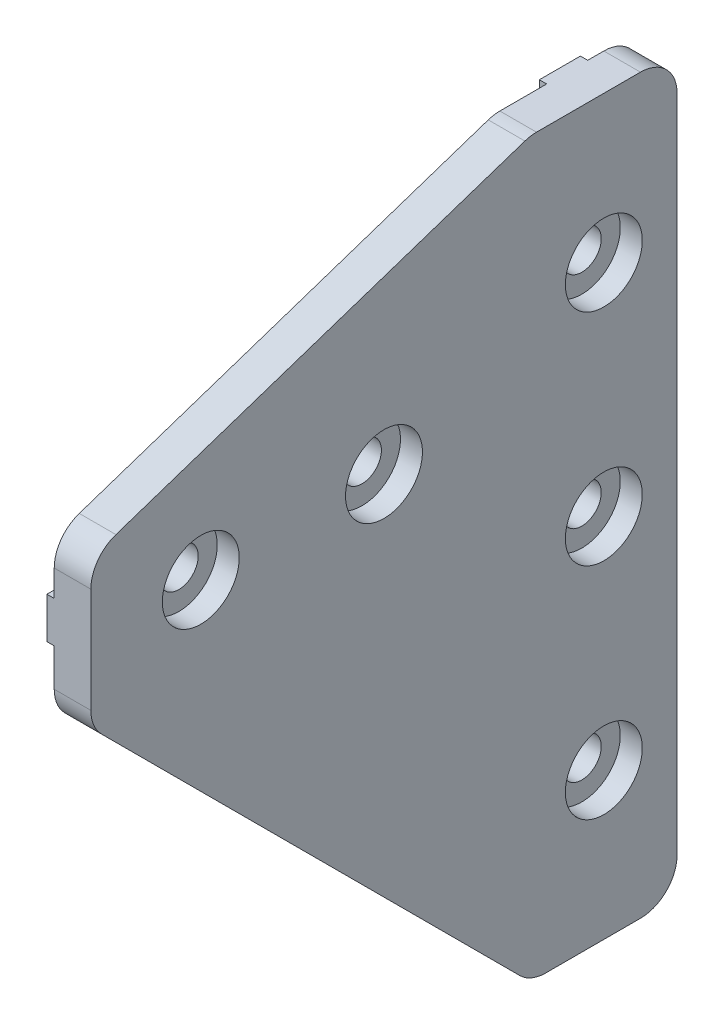
ISO-10303-21;
HEADER;
FILE_DESCRIPTION(('STEP AP214'),'2;1');
FILE_NAME('part.step','',(''),(''),'','','');
FILE_SCHEMA(('AUTOMOTIVE_DESIGN { 1 0 10303 214 1 1 1 1 }'));
ENDSEC;
DATA;
#1=APPLICATION_CONTEXT('core data for automotive mechanical design processes');
#2=APPLICATION_PROTOCOL_DEFINITION('international standard','automotive_design',2000,#1);
#3=PRODUCT_CONTEXT('',#1,'mechanical');
#4=PRODUCT('Part','Part','',(#3));
#5=PRODUCT_RELATED_PRODUCT_CATEGORY('part','',(#4));
#6=PRODUCT_DEFINITION_FORMATION('','',#4);
#7=PRODUCT_DEFINITION_CONTEXT('part definition',#1,'design');
#8=PRODUCT_DEFINITION('design','',#6,#7);
#9=PRODUCT_DEFINITION_SHAPE('','',#8);
#10=(LENGTH_UNIT() NAMED_UNIT(*) SI_UNIT(.MILLI.,.METRE.));
#11=(NAMED_UNIT(*) PLANE_ANGLE_UNIT() SI_UNIT($,.RADIAN.));
#12=(NAMED_UNIT(*) SI_UNIT($,.STERADIAN.) SOLID_ANGLE_UNIT());
#13=UNCERTAINTY_MEASURE_WITH_UNIT(LENGTH_MEASURE(1.E-05),#10,'distance_accuracy_value','');
#14=(GEOMETRIC_REPRESENTATION_CONTEXT(3) GLOBAL_UNCERTAINTY_ASSIGNED_CONTEXT((#13)) GLOBAL_UNIT_ASSIGNED_CONTEXT((#10,
#11,#12)) REPRESENTATION_CONTEXT('',''));
#15=CARTESIAN_POINT('',(0.,0.,0.));
#16=DIRECTION('',(0.,0.,1.));
#17=DIRECTION('',(1.,0.,0.));
#18=AXIS2_PLACEMENT_3D('',#15,#16,#17);
#19=CARTESIAN_POINT('',(67.5,0.,40.));
#20=DIRECTION('',(1.,0.,0.));
#21=DIRECTION('',(0.,-1.,0.));
#22=AXIS2_PLACEMENT_3D('',#19,#20,#21);
#23=PLANE('',#22);
#24=DIRECTION('',(0.,-1.,0.));
#25=VECTOR('',#24,1.);
#26=CARTESIAN_POINT('',(67.5,120.,80.));
#27=LINE('',#26,#25);
#28=CARTESIAN_POINT('',(67.5,117.2,80.));
#29=VERTEX_POINT('',#28);
#30=CARTESIAN_POINT('',(67.5,112.071067811865,80.));
#31=VERTEX_POINT('',#30);
#32=EDGE_CURVE('E401',#29,#31,#27,.T.);
#33=ORIENTED_EDGE('',*,*,#32,.F.);
#34=DIRECTION('',(0.,0.,-1.));
#35=VECTOR('',#34,1.);
#36=CARTESIAN_POINT('',(67.5,117.2,52.5));
#37=LINE('',#36,#35);
#38=CARTESIAN_POINT('',(67.5,117.2,25.));
#39=VERTEX_POINT('',#38);
#40=EDGE_CURVE('E208',#29,#39,#37,.T.);
#41=ORIENTED_EDGE('',*,*,#40,.T.);
#42=DIRECTION('',(0.,1.,0.));
#43=VECTOR('',#42,1.);
#44=CARTESIAN_POINT('',(67.5,120.,25.));
#45=LINE('',#44,#43);
#46=CARTESIAN_POINT('',(67.5,122.8,25.));
#47=VERTEX_POINT('',#46);
#48=EDGE_CURVE('E223',#39,#47,#45,.T.);
#49=ORIENTED_EDGE('',*,*,#48,.T.);
#50=DIRECTION('',(0.,0.,-1.));
#51=VECTOR('',#50,1.);
#52=CARTESIAN_POINT('',(67.5,122.8,52.5));
#53=LINE('',#52,#51);
#54=CARTESIAN_POINT('',(67.5,122.8,80.));
#55=VERTEX_POINT('',#54);
#56=EDGE_CURVE('E37',#55,#47,#53,.T.);
#57=ORIENTED_EDGE('',*,*,#56,.F.);
#58=CARTESIAN_POINT('',(67.5,126.396203899719,80.));
#59=VERTEX_POINT('',#58);
#60=EDGE_CURVE('E402',#59,#55,#27,.T.);
#61=ORIENTED_EDGE('',*,*,#60,.F.);
#62=CARTESIAN_POINT('',(67.5,126.396203899719,75.));
#63=DIRECTION('',(-1.,0.,0.));
#64=DIRECTION('',(0.,0.,1.));
#65=AXIS2_PLACEMENT_3D('',#62,#63,#64);
#66=CIRCLE('',#65,5.);
#67=CARTESIAN_POINT('',(67.5,131.139620389972,76.5811388300842));
#68=VERTEX_POINT('',#67);
#69=EDGE_CURVE('E430',#68,#59,#66,.F.);
#70=ORIENTED_EDGE('',*,*,#69,.F.);
#71=DIRECTION('',(0.,-0.316227766016837,0.948683298050514));
#72=VECTOR('',#71,1.);
#73=CARTESIAN_POINT('',(67.5,140.,50.));
#74=LINE('',#73,#72);
#75=CARTESIAN_POINT('',(67.5,149.743416490253,20.7697505292423));
#76=VERTEX_POINT('',#75);
#77=EDGE_CURVE('E317',#76,#68,#74,.T.);
#78=ORIENTED_EDGE('',*,*,#77,.F.);
#79=CARTESIAN_POINT('',(67.5,145.,19.1886116991581));
#80=DIRECTION('',(-1.,0.,0.));
#81=DIRECTION('',(0.,0.,1.));
#82=AXIS2_PLACEMENT_3D('',#79,#80,#81);
#83=CIRCLE('',#82,5.);
#84=CARTESIAN_POINT('',(67.5,150.,19.1886116991581));
#85=VERTEX_POINT('',#84);
#86=EDGE_CURVE('E440',#85,#76,#83,.F.);
#87=ORIENTED_EDGE('',*,*,#86,.F.);
#88=DIRECTION('',(0.,0.,1.));
#89=VECTOR('',#88,1.);
#90=CARTESIAN_POINT('',(67.5,150.,10.));
#91=LINE('',#90,#89);
#92=CARTESIAN_POINT('',(67.5,150.,12.8));
#93=VERTEX_POINT('',#92);
#94=EDGE_CURVE('E413',#93,#85,#91,.T.);
#95=ORIENTED_EDGE('',*,*,#94,.F.);
#96=DIRECTION('',(0.,1.,0.));
#97=VECTOR('',#96,1.);
#98=CARTESIAN_POINT('',(67.5,100.,12.8));
#99=LINE('',#98,#97);
#100=CARTESIAN_POINT('',(67.5,50.,12.8));
#101=VERTEX_POINT('',#100);
#102=EDGE_CURVE('E49',#101,#93,#99,.T.);
#103=ORIENTED_EDGE('',*,*,#102,.F.);
#104=DIRECTION('',(0.,0.,1.));
#105=VECTOR('',#104,1.);
#106=CARTESIAN_POINT('',(67.5,50.,10.));
#107=LINE('',#106,#105);
#108=CARTESIAN_POINT('',(67.5,50.,17.9289321881345));
#109=VERTEX_POINT('',#108);
#110=EDGE_CURVE('E409',#101,#109,#107,.T.);
#111=ORIENTED_EDGE('',*,*,#110,.T.);
#112=CARTESIAN_POINT('',(67.5,55.,17.9289321881345));
#113=DIRECTION('',(-1.,0.,0.));
#114=DIRECTION('',(0.,0.,1.));
#115=AXIS2_PLACEMENT_3D('',#112,#113,#114);
#116=CIRCLE('',#115,5.);
#117=CARTESIAN_POINT('',(67.5,51.4644660940672,21.4644660940672));
#118=VERTEX_POINT('',#117);
#119=EDGE_CURVE('E436',#118,#109,#116,.F.);
#120=ORIENTED_EDGE('',*,*,#119,.F.);
#121=DIRECTION('',(0.,-0.707106781186548,-0.707106781186548));
#122=VECTOR('',#121,1.);
#123=CARTESIAN_POINT('',(67.5,80.,50.));
#124=LINE('',#123,#122);
#125=CARTESIAN_POINT('',(67.5,108.535533905933,78.5355339059327));
#126=VERTEX_POINT('',#125);
#127=EDGE_CURVE('E397',#126,#118,#124,.T.);
#128=ORIENTED_EDGE('',*,*,#127,.F.);
#129=CARTESIAN_POINT('',(67.5,112.071067811865,75.));
#130=DIRECTION('',(-1.,0.,0.));
#131=DIRECTION('',(0.,0.,1.));
#132=AXIS2_PLACEMENT_3D('',#129,#130,#131);
#133=CIRCLE('',#132,5.);
#134=EDGE_CURVE('E433',#31,#126,#133,.F.);
#135=ORIENTED_EDGE('',*,*,#134,.F.);
#136=EDGE_LOOP('',(#33,#41,#49,#57,#61,#70,#78,#87,#95,#103,#111,#120,#128,#135));
#137=FACE_BOUND('',#136,.T.);
#138=ADVANCED_FACE('F16',(#137),#23,.F.);
#139=CARTESIAN_POINT('',(72.5,100.,10.));
#140=DIRECTION('',(-1.,0.,0.));
#141=DIRECTION('',(0.,0.,-1.));
#142=AXIS2_PLACEMENT_3D('',#139,#140,#141);
#143=CYLINDRICAL_SURFACE('',#142,2.65);
#144=CARTESIAN_POINT('',(69.5,100.,10.));
#145=DIRECTION('',(-1.,0.,0.));
#146=DIRECTION('',(0.,0.,1.));
#147=AXIS2_PLACEMENT_3D('',#144,#145,#146);
#148=CIRCLE('',#147,2.65);
#149=CARTESIAN_POINT('',(69.5,100.,12.65));
#150=VERTEX_POINT('',#149);
#151=EDGE_CURVE('E345',#150,#150,#148,.T.);
#152=ORIENTED_EDGE('',*,*,#151,.F.);
#153=EDGE_LOOP('',(#152));
#154=FACE_BOUND('',#153,.T.);
#155=CARTESIAN_POINT('',(66.5,100.,10.));
#156=DIRECTION('',(-1.,0.,0.));
#157=DIRECTION('',(0.,0.,1.));
#158=AXIS2_PLACEMENT_3D('',#155,#156,#157);
#159=CIRCLE('',#158,2.65);
#160=CARTESIAN_POINT('',(66.5,100.,12.65));
#161=VERTEX_POINT('',#160);
#162=EDGE_CURVE('E264',#161,#161,#159,.T.);
#163=ORIENTED_EDGE('',*,*,#162,.T.);
#164=EDGE_LOOP('',(#163));
#165=FACE_BOUND('',#164,.T.);
#166=ADVANCED_FACE('F578',(#154,#165),#143,.F.);
#167=CARTESIAN_POINT('',(72.5,130.,10.));
#168=DIRECTION('',(-1.,0.,0.));
#169=DIRECTION('',(0.,0.,-1.));
#170=AXIS2_PLACEMENT_3D('',#167,#168,#169);
#171=CYLINDRICAL_SURFACE('',#170,2.65);
#172=CARTESIAN_POINT('',(69.5,130.,10.));
#173=DIRECTION('',(-1.,0.,0.));
#174=DIRECTION('',(0.,0.,1.));
#175=AXIS2_PLACEMENT_3D('',#172,#173,#174);
#176=CIRCLE('',#175,2.65);
#177=CARTESIAN_POINT('',(69.5,130.,12.65));
#178=VERTEX_POINT('',#177);
#179=EDGE_CURVE('E333',#178,#178,#176,.T.);
#180=ORIENTED_EDGE('',*,*,#179,.F.);
#181=EDGE_LOOP('',(#180));
#182=FACE_BOUND('',#181,.T.);
#183=CARTESIAN_POINT('',(66.5,130.,10.));
#184=DIRECTION('',(-1.,0.,0.));
#185=DIRECTION('',(0.,0.,1.));
#186=AXIS2_PLACEMENT_3D('',#183,#184,#185);
#187=CIRCLE('',#186,2.65);
#188=CARTESIAN_POINT('',(66.5,130.,12.65));
#189=VERTEX_POINT('',#188);
#190=EDGE_CURVE('E269',#189,#189,#187,.T.);
#191=ORIENTED_EDGE('',*,*,#190,.T.);
#192=EDGE_LOOP('',(#191));
#193=FACE_BOUND('',#192,.T.);
#194=ADVANCED_FACE('F585',(#182,#193),#171,.F.);
#195=CARTESIAN_POINT('',(72.5,120.,40.));
#196=DIRECTION('',(-1.,0.,0.));
#197=DIRECTION('',(0.,0.,-1.));
#198=AXIS2_PLACEMENT_3D('',#195,#196,#197);
#199=CYLINDRICAL_SURFACE('',#198,2.65);
#200=CARTESIAN_POINT('',(69.5,120.,40.));
#201=DIRECTION('',(-1.,0.,0.));
#202=DIRECTION('',(0.,0.,1.));
#203=AXIS2_PLACEMENT_3D('',#200,#201,#202);
#204=CIRCLE('',#203,2.65);
#205=CARTESIAN_POINT('',(69.5,120.,42.65));
#206=VERTEX_POINT('',#205);
#207=EDGE_CURVE('E322',#206,#206,#204,.T.);
#208=ORIENTED_EDGE('',*,*,#207,.F.);
#209=EDGE_LOOP('',(#208));
#210=FACE_BOUND('',#209,.T.);
#211=CARTESIAN_POINT('',(66.5,120.,40.));
#212=DIRECTION('',(-1.,0.,0.));
#213=DIRECTION('',(0.,0.,1.));
#214=AXIS2_PLACEMENT_3D('',#211,#212,#213);
#215=CIRCLE('',#214,2.65);
#216=CARTESIAN_POINT('',(66.5,120.,42.65));
#217=VERTEX_POINT('',#216);
#218=EDGE_CURVE('E242',#217,#217,#215,.T.);
#219=ORIENTED_EDGE('',*,*,#218,.T.);
#220=EDGE_LOOP('',(#219));
#221=FACE_BOUND('',#220,.T.);
#222=ADVANCED_FACE('F593',(#210,#221),#199,.F.);
#223=CARTESIAN_POINT('',(72.5,120.,65.));
#224=DIRECTION('',(-1.,0.,0.));
#225=DIRECTION('',(0.,0.,-1.));
#226=AXIS2_PLACEMENT_3D('',#223,#224,#225);
#227=CYLINDRICAL_SURFACE('',#226,2.65);
#228=CARTESIAN_POINT('',(69.5,120.,65.));
#229=DIRECTION('',(-1.,0.,0.));
#230=DIRECTION('',(0.,0.,1.));
#231=AXIS2_PLACEMENT_3D('',#228,#229,#230);
#232=CIRCLE('',#231,2.65);
#233=CARTESIAN_POINT('',(69.5,120.,67.65));
#234=VERTEX_POINT('',#233);
#235=EDGE_CURVE('E312',#234,#234,#232,.T.);
#236=ORIENTED_EDGE('',*,*,#235,.F.);
#237=EDGE_LOOP('',(#236));
#238=FACE_BOUND('',#237,.T.);
#239=CARTESIAN_POINT('',(66.5,120.,65.));
#240=DIRECTION('',(-1.,0.,0.));
#241=DIRECTION('',(0.,0.,1.));
#242=AXIS2_PLACEMENT_3D('',#239,#240,#241);
#243=CIRCLE('',#242,2.65);
#244=CARTESIAN_POINT('',(66.5,120.,67.65));
#245=VERTEX_POINT('',#244);
#246=EDGE_CURVE('E238',#245,#245,#243,.T.);
#247=ORIENTED_EDGE('',*,*,#246,.T.);
#248=EDGE_LOOP('',(#247));
#249=FACE_BOUND('',#248,.T.);
#250=ADVANCED_FACE('F600',(#238,#249),#227,.F.);
#251=CARTESIAN_POINT('',(72.5,70.,10.));
#252=DIRECTION('',(-1.,0.,0.));
#253=DIRECTION('',(0.,0.,-1.));
#254=AXIS2_PLACEMENT_3D('',#251,#252,#253);
#255=CYLINDRICAL_SURFACE('',#254,2.65);
#256=CARTESIAN_POINT('',(69.5,70.,10.));
#257=DIRECTION('',(-1.,0.,0.));
#258=DIRECTION('',(0.,0.,1.));
#259=AXIS2_PLACEMENT_3D('',#256,#257,#258);
#260=CIRCLE('',#259,2.65);
#261=CARTESIAN_POINT('',(69.5,70.,12.65));
#262=VERTEX_POINT('',#261);
#263=EDGE_CURVE('E357',#262,#262,#260,.T.);
#264=ORIENTED_EDGE('',*,*,#263,.F.);
#265=EDGE_LOOP('',(#264));
#266=FACE_BOUND('',#265,.T.);
#267=CARTESIAN_POINT('',(66.5,70.,10.));
#268=DIRECTION('',(-1.,0.,0.));
#269=DIRECTION('',(0.,0.,1.));
#270=AXIS2_PLACEMENT_3D('',#267,#268,#269);
#271=CIRCLE('',#270,2.65);
#272=CARTESIAN_POINT('',(66.5,70.,12.65));
#273=VERTEX_POINT('',#272);
#274=EDGE_CURVE('E260',#273,#273,#271,.T.);
#275=ORIENTED_EDGE('',*,*,#274,.T.);
#276=EDGE_LOOP('',(#275));
#277=FACE_BOUND('',#276,.T.);
#278=ADVANCED_FACE('F607',(#266,#277),#255,.F.);
#279=CARTESIAN_POINT('',(72.5,140.,50.));
#280=DIRECTION('',(0.,0.948683298050514,0.316227766016837));
#281=DIRECTION('',(0.,-0.316227766016837,0.948683298050514));
#282=AXIS2_PLACEMENT_3D('',#279,#280,#281);
#283=PLANE('',#282);
#284=ORIENTED_EDGE('',*,*,#77,.T.);
#285=DIRECTION('',(-1.,0.,0.));
#286=VECTOR('',#285,1.);
#287=CARTESIAN_POINT('',(72.5,131.139620389972,76.5811388300842));
#288=LINE('',#287,#286);
#289=CARTESIAN_POINT('',(72.5,131.139620389972,76.5811388300842));
#290=VERTEX_POINT('',#289);
#291=EDGE_CURVE('E443',#290,#68,#288,.T.);
#292=ORIENTED_EDGE('',*,*,#291,.F.);
#293=DIRECTION('',(0.,-0.316227766016837,0.948683298050514));
#294=VECTOR('',#293,1.);
#295=CARTESIAN_POINT('',(72.5,140.,50.));
#296=LINE('',#295,#294);
#297=CARTESIAN_POINT('',(72.5,149.743416490253,20.7697505292423));
#298=VERTEX_POINT('',#297);
#299=EDGE_CURVE('E368',#298,#290,#296,.T.);
#300=ORIENTED_EDGE('',*,*,#299,.F.);
#301=DIRECTION('',(-1.,0.,0.));
#302=VECTOR('',#301,1.);
#303=CARTESIAN_POINT('',(72.5,149.743416490253,20.7697505292423));
#304=LINE('',#303,#302);
#305=EDGE_CURVE('E447',#76,#298,#304,.F.);
#306=ORIENTED_EDGE('',*,*,#305,.F.);
#307=EDGE_LOOP('',(#284,#292,#300,#306));
#308=FACE_BOUND('',#307,.T.);
#309=ADVANCED_FACE('F540',(#308),#283,.T.);
#310=CARTESIAN_POINT('',(72.5,150.,10.));
#311=DIRECTION('',(0.,1.,0.));
#312=DIRECTION('',(0.,0.,1.));
#313=AXIS2_PLACEMENT_3D('',#310,#311,#312);
#314=PLANE('',#313);
#315=DIRECTION('',(0.,0.,1.));
#316=VECTOR('',#315,1.);
#317=CARTESIAN_POINT('',(72.5,150.,10.));
#318=LINE('',#317,#316);
#319=CARTESIAN_POINT('',(72.5,150.,5.));
#320=VERTEX_POINT('',#319);
#321=CARTESIAN_POINT('',(72.5,150.,19.1886116991581));
#322=VERTEX_POINT('',#321);
#323=EDGE_CURVE('E389',#320,#322,#318,.T.);
#324=ORIENTED_EDGE('',*,*,#323,.F.);
#325=DIRECTION('',(-1.,0.,0.));
#326=VECTOR('',#325,1.);
#327=CARTESIAN_POINT('',(72.5,150.,5.));
#328=LINE('',#327,#326);
#329=CARTESIAN_POINT('',(67.5,150.,5.));
#330=VERTEX_POINT('',#329);
#331=EDGE_CURVE('E393',#330,#320,#328,.F.);
#332=ORIENTED_EDGE('',*,*,#331,.F.);
#333=CARTESIAN_POINT('',(67.5,150.,7.2000000000001));
#334=VERTEX_POINT('',#333);
#335=EDGE_CURVE('E373',#330,#334,#91,.T.);
#336=ORIENTED_EDGE('',*,*,#335,.T.);
#337=DIRECTION('',(1.,0.,0.));
#338=VECTOR('',#337,1.);
#339=CARTESIAN_POINT('',(66.5,150.,7.2000000000001));
#340=LINE('',#339,#338);
#341=CARTESIAN_POINT('',(66.5,150.,7.2000000000001));
#342=VERTEX_POINT('',#341);
#343=EDGE_CURVE('E295',#342,#334,#340,.T.);
#344=ORIENTED_EDGE('',*,*,#343,.F.);
#345=DIRECTION('',(0.,0.,1.));
#346=VECTOR('',#345,1.);
#347=CARTESIAN_POINT('',(66.5,150.,10.));
#348=LINE('',#347,#346);
#349=CARTESIAN_POINT('',(66.5,150.,12.8));
#350=VERTEX_POINT('',#349);
#351=EDGE_CURVE('E280',#342,#350,#348,.T.);
#352=ORIENTED_EDGE('',*,*,#351,.T.);
#353=DIRECTION('',(1.,0.,0.));
#354=VECTOR('',#353,1.);
#355=CARTESIAN_POINT('',(66.5,150.,12.8));
#356=LINE('',#355,#354);
#357=EDGE_CURVE('E299',#350,#93,#356,.T.);
#358=ORIENTED_EDGE('',*,*,#357,.T.);
#359=ORIENTED_EDGE('',*,*,#94,.T.);
#360=DIRECTION('',(-1.,0.,0.));
#361=VECTOR('',#360,1.);
#362=CARTESIAN_POINT('',(72.5,150.,19.1886116991581));
#363=LINE('',#362,#361);
#364=EDGE_CURVE('E420',#322,#85,#363,.T.);
#365=ORIENTED_EDGE('',*,*,#364,.F.);
#366=EDGE_LOOP('',(#324,#332,#336,#344,#352,#358,#359,#365));
#367=FACE_BOUND('',#366,.T.);
#368=ADVANCED_FACE('F509',(#367),#314,.T.);
#369=CARTESIAN_POINT('',(72.5,-150.,0.));
#370=DIRECTION('',(0.,0.,-1.));
#371=DIRECTION('',(1.,0.,0.));
#372=AXIS2_PLACEMENT_3D('',#369,#370,#371);
#373=PLANE('',#372);
#374=DIRECTION('',(0.,1.,0.));
#375=VECTOR('',#374,1.);
#376=CARTESIAN_POINT('',(67.5,-150.,0.));
#377=LINE('',#376,#375);
#378=CARTESIAN_POINT('',(67.5,55.,0.));
#379=VERTEX_POINT('',#378);
#380=CARTESIAN_POINT('',(67.5,145.,0.));
#381=VERTEX_POINT('',#380);
#382=EDGE_CURVE('E405',#379,#381,#377,.T.);
#383=ORIENTED_EDGE('',*,*,#382,.T.);
#384=DIRECTION('',(-1.,0.,0.));
#385=VECTOR('',#384,1.);
#386=CARTESIAN_POINT('',(72.5,145.,0.));
#387=LINE('',#386,#385);
#388=CARTESIAN_POINT('',(72.5,145.,0.));
#389=VERTEX_POINT('',#388);
#390=EDGE_CURVE('E25',#389,#381,#387,.T.);
#391=ORIENTED_EDGE('',*,*,#390,.F.);
#392=DIRECTION('',(0.,1.,0.));
#393=VECTOR('',#392,1.);
#394=CARTESIAN_POINT('',(72.5,-150.,0.));
#395=LINE('',#394,#393);
#396=CARTESIAN_POINT('',(72.5,55.,0.));
#397=VERTEX_POINT('',#396);
#398=EDGE_CURVE('E381',#397,#389,#395,.T.);
#399=ORIENTED_EDGE('',*,*,#398,.F.);
#400=DIRECTION('',(-1.,0.,0.));
#401=VECTOR('',#400,1.);
#402=CARTESIAN_POINT('',(72.5,55.,0.));
#403=LINE('',#402,#401);
#404=EDGE_CURVE('E10',#379,#397,#403,.F.);
#405=ORIENTED_EDGE('',*,*,#404,.F.);
#406=EDGE_LOOP('',(#383,#391,#399,#405));
#407=FACE_BOUND('',#406,.T.);
#408=ADVANCED_FACE('F502',(#407),#373,.T.);
#409=CARTESIAN_POINT('',(72.5,50.,10.));
#410=DIRECTION('',(0.,1.,0.));
#411=DIRECTION('',(0.,0.,1.));
#412=AXIS2_PLACEMENT_3D('',#409,#410,#411);
#413=PLANE('',#412);
#414=CARTESIAN_POINT('',(67.5,50.,5.));
#415=VERTEX_POINT('',#414);
#416=CARTESIAN_POINT('',(67.5,50.,7.2000000000001));
#417=VERTEX_POINT('',#416);
#418=EDGE_CURVE('E410',#415,#417,#107,.T.);
#419=ORIENTED_EDGE('',*,*,#418,.F.);
#420=DIRECTION('',(-1.,0.,0.));
#421=VECTOR('',#420,1.);
#422=CARTESIAN_POINT('',(67.5,50.,5.));
#423=LINE('',#422,#421);
#424=CARTESIAN_POINT('',(72.5,50.,5.));
#425=VERTEX_POINT('',#424);
#426=EDGE_CURVE('E477',#425,#415,#423,.T.);
#427=ORIENTED_EDGE('',*,*,#426,.F.);
#428=DIRECTION('',(0.,0.,1.));
#429=VECTOR('',#428,1.);
#430=CARTESIAN_POINT('',(72.5,50.,10.));
#431=LINE('',#430,#429);
#432=CARTESIAN_POINT('',(72.5,50.,17.9289321881345));
#433=VERTEX_POINT('',#432);
#434=EDGE_CURVE('E385',#425,#433,#431,.T.);
#435=ORIENTED_EDGE('',*,*,#434,.T.);
#436=DIRECTION('',(-1.,0.,0.));
#437=VECTOR('',#436,1.);
#438=CARTESIAN_POINT('',(72.5,50.,17.9289321881345));
#439=LINE('',#438,#437);
#440=EDGE_CURVE('E481',#109,#433,#439,.F.);
#441=ORIENTED_EDGE('',*,*,#440,.F.);
#442=ORIENTED_EDGE('',*,*,#110,.F.);
#443=DIRECTION('',(1.,0.,0.));
#444=VECTOR('',#443,1.);
#445=CARTESIAN_POINT('',(66.5,50.,12.8));
#446=LINE('',#445,#444);
#447=CARTESIAN_POINT('',(66.5,50.,12.8));
#448=VERTEX_POINT('',#447);
#449=EDGE_CURVE('E303',#448,#101,#446,.T.);
#450=ORIENTED_EDGE('',*,*,#449,.F.);
#451=DIRECTION('',(0.,0.,1.));
#452=VECTOR('',#451,1.);
#453=CARTESIAN_POINT('',(66.5,50.,10.));
#454=LINE('',#453,#452);
#455=CARTESIAN_POINT('',(66.5,50.,7.20000000000011));
#456=VERTEX_POINT('',#455);
#457=EDGE_CURVE('E273',#456,#448,#454,.T.);
#458=ORIENTED_EDGE('',*,*,#457,.F.);
#459=DIRECTION('',(1.,0.,0.));
#460=VECTOR('',#459,1.);
#461=CARTESIAN_POINT('',(66.5,50.,7.20000000000011));
#462=LINE('',#461,#460);
#463=EDGE_CURVE('E288',#456,#417,#462,.T.);
#464=ORIENTED_EDGE('',*,*,#463,.T.);
#465=EDGE_LOOP('',(#419,#427,#435,#441,#442,#450,#458,#464));
#466=FACE_BOUND('',#465,.T.);
#467=ADVANCED_FACE('F519',(#466),#413,.F.);
#468=CARTESIAN_POINT('',(72.5,80.,50.));
#469=DIRECTION('',(0.,-0.707106781186548,0.707106781186548));
#470=DIRECTION('',(0.,-0.707106781186548,-0.707106781186548));
#471=AXIS2_PLACEMENT_3D('',#468,#469,#470);
#472=PLANE('',#471);
#473=DIRECTION('',(0.,-0.707106781186548,-0.707106781186548));
#474=VECTOR('',#473,1.);
#475=CARTESIAN_POINT('',(72.5,80.,50.));
#476=LINE('',#475,#474);
#477=CARTESIAN_POINT('',(72.5,108.535533905933,78.5355339059327));
#478=VERTEX_POINT('',#477);
#479=CARTESIAN_POINT('',(72.5,51.4644660940672,21.4644660940672));
#480=VERTEX_POINT('',#479);
#481=EDGE_CURVE('E372',#478,#480,#476,.T.);
#482=ORIENTED_EDGE('',*,*,#481,.F.);
#483=DIRECTION('',(-1.,0.,0.));
#484=VECTOR('',#483,1.);
#485=CARTESIAN_POINT('',(72.5,108.535533905933,78.5355339059327));
#486=LINE('',#485,#484);
#487=EDGE_CURVE('E469',#126,#478,#486,.F.);
#488=ORIENTED_EDGE('',*,*,#487,.F.);
#489=ORIENTED_EDGE('',*,*,#127,.T.);
#490=DIRECTION('',(-1.,0.,0.));
#491=VECTOR('',#490,1.);
#492=CARTESIAN_POINT('',(67.5,51.4644660940672,21.4644660940672));
#493=LINE('',#492,#491);
#494=EDGE_CURVE('E473',#480,#118,#493,.T.);
#495=ORIENTED_EDGE('',*,*,#494,.F.);
#496=EDGE_LOOP('',(#482,#488,#489,#495));
#497=FACE_BOUND('',#496,.T.);
#498=ADVANCED_FACE('F554',(#497),#472,.T.);
#499=CARTESIAN_POINT('',(72.5,120.,80.));
#500=DIRECTION('',(0.,0.,1.));
#501=DIRECTION('',(-1.,0.,0.));
#502=AXIS2_PLACEMENT_3D('',#499,#500,#501);
#503=PLANE('',#502);
#504=DIRECTION('',(0.,-1.,0.));
#505=VECTOR('',#504,1.);
#506=CARTESIAN_POINT('',(72.5,120.,80.));
#507=LINE('',#506,#505);
#508=CARTESIAN_POINT('',(72.5,126.396203899719,80.));
#509=VERTEX_POINT('',#508);
#510=CARTESIAN_POINT('',(72.5,112.071067811865,80.));
#511=VERTEX_POINT('',#510);
#512=EDGE_CURVE('E377',#509,#511,#507,.T.);
#513=ORIENTED_EDGE('',*,*,#512,.F.);
#514=DIRECTION('',(-1.,0.,0.));
#515=VECTOR('',#514,1.);
#516=CARTESIAN_POINT('',(72.5,126.396203899719,80.));
#517=LINE('',#516,#515);
#518=EDGE_CURVE('E485',#59,#509,#517,.F.);
#519=ORIENTED_EDGE('',*,*,#518,.F.);
#520=ORIENTED_EDGE('',*,*,#60,.T.);
#521=DIRECTION('',(1.,0.,0.));
#522=VECTOR('',#521,1.);
#523=CARTESIAN_POINT('',(66.5,122.8,80.));
#524=LINE('',#523,#522);
#525=CARTESIAN_POINT('',(66.5,122.8,80.));
#526=VERTEX_POINT('',#525);
#527=EDGE_CURVE('E213',#526,#55,#524,.T.);
#528=ORIENTED_EDGE('',*,*,#527,.F.);
#529=DIRECTION('',(0.,-1.,0.));
#530=VECTOR('',#529,1.);
#531=CARTESIAN_POINT('',(66.5,120.,80.));
#532=LINE('',#531,#530);
#533=CARTESIAN_POINT('',(66.5,117.2,80.));
#534=VERTEX_POINT('',#533);
#535=EDGE_CURVE('E219',#526,#534,#532,.T.);
#536=ORIENTED_EDGE('',*,*,#535,.T.);
#537=DIRECTION('',(1.,0.,0.));
#538=VECTOR('',#537,1.);
#539=CARTESIAN_POINT('',(66.5,117.2,80.));
#540=LINE('',#539,#538);
#541=EDGE_CURVE('E202',#534,#29,#540,.T.);
#542=ORIENTED_EDGE('',*,*,#541,.T.);
#543=ORIENTED_EDGE('',*,*,#32,.T.);
#544=DIRECTION('',(-1.,0.,0.));
#545=VECTOR('',#544,1.);
#546=CARTESIAN_POINT('',(72.5,112.071067811865,80.));
#547=LINE('',#546,#545);
#548=EDGE_CURVE('E489',#511,#31,#547,.T.);
#549=ORIENTED_EDGE('',*,*,#548,.F.);
#550=EDGE_LOOP('',(#513,#519,#520,#528,#536,#542,#543,#549));
#551=FACE_BOUND('',#550,.T.);
#552=ADVANCED_FACE('F226',(#551),#503,.T.);
#553=CARTESIAN_POINT('',(72.5,0.,40.));
#554=DIRECTION('',(1.,0.,0.));
#555=DIRECTION('',(0.,-1.,0.));
#556=AXIS2_PLACEMENT_3D('',#553,#554,#555);
#557=PLANE('',#556);
#558=CARTESIAN_POINT('',(72.5,120.,65.));
#559=DIRECTION('',(-1.,0.,0.));
#560=DIRECTION('',(0.,0.,1.));
#561=AXIS2_PLACEMENT_3D('',#558,#559,#560);
#562=CIRCLE('',#561,5.25);
#563=CARTESIAN_POINT('',(72.5,120.,70.25));
#564=VERTEX_POINT('',#563);
#565=EDGE_CURVE('E313',#564,#564,#562,.T.);
#566=ORIENTED_EDGE('',*,*,#565,.T.);
#567=EDGE_LOOP('',(#566));
#568=FACE_BOUND('',#567,.T.);
#569=CARTESIAN_POINT('',(72.5,120.,40.));
#570=DIRECTION('',(-1.,0.,0.));
#571=DIRECTION('',(0.,0.,1.));
#572=AXIS2_PLACEMENT_3D('',#569,#570,#571);
#573=CIRCLE('',#572,5.25);
#574=CARTESIAN_POINT('',(72.5,120.,45.25));
#575=VERTEX_POINT('',#574);
#576=EDGE_CURVE('E326',#575,#575,#573,.T.);
#577=ORIENTED_EDGE('',*,*,#576,.T.);
#578=EDGE_LOOP('',(#577));
#579=FACE_BOUND('',#578,.T.);
#580=CARTESIAN_POINT('',(72.5,130.,10.));
#581=DIRECTION('',(-1.,0.,0.));
#582=DIRECTION('',(0.,0.,1.));
#583=AXIS2_PLACEMENT_3D('',#580,#581,#582);
#584=CIRCLE('',#583,5.25);
#585=CARTESIAN_POINT('',(72.5,130.,15.25));
#586=VERTEX_POINT('',#585);
#587=EDGE_CURVE('E338',#586,#586,#584,.T.);
#588=ORIENTED_EDGE('',*,*,#587,.T.);
#589=EDGE_LOOP('',(#588));
#590=FACE_BOUND('',#589,.T.);
#591=CARTESIAN_POINT('',(72.5,100.,10.));
#592=DIRECTION('',(-1.,0.,0.));
#593=DIRECTION('',(0.,0.,1.));
#594=AXIS2_PLACEMENT_3D('',#591,#592,#593);
#595=CIRCLE('',#594,5.25);
#596=CARTESIAN_POINT('',(72.5,100.,15.25));
#597=VERTEX_POINT('',#596);
#598=EDGE_CURVE('E350',#597,#597,#595,.T.);
#599=ORIENTED_EDGE('',*,*,#598,.T.);
#600=EDGE_LOOP('',(#599));
#601=FACE_BOUND('',#600,.T.);
#602=CARTESIAN_POINT('',(72.5,70.,10.));
#603=DIRECTION('',(-1.,0.,0.));
#604=DIRECTION('',(0.,0.,1.));
#605=AXIS2_PLACEMENT_3D('',#602,#603,#604);
#606=CIRCLE('',#605,5.25);
#607=CARTESIAN_POINT('',(72.5,70.,15.25));
#608=VERTEX_POINT('',#607);
#609=EDGE_CURVE('E307',#608,#608,#606,.T.);
#610=ORIENTED_EDGE('',*,*,#609,.T.);
#611=EDGE_LOOP('',(#610));
#612=FACE_BOUND('',#611,.T.);
#613=ORIENTED_EDGE('',*,*,#299,.T.);
#614=CARTESIAN_POINT('',(72.5,126.396203899719,75.));
#615=DIRECTION('',(-1.,0.,0.));
#616=DIRECTION('',(0.,0.,1.));
#617=AXIS2_PLACEMENT_3D('',#614,#615,#616);
#618=CIRCLE('',#617,5.);
#619=EDGE_CURVE('E457',#509,#290,#618,.T.);
#620=ORIENTED_EDGE('',*,*,#619,.F.);
#621=ORIENTED_EDGE('',*,*,#512,.T.);
#622=CARTESIAN_POINT('',(72.5,112.071067811865,75.));
#623=DIRECTION('',(-1.,0.,0.));
#624=DIRECTION('',(0.,0.,1.));
#625=AXIS2_PLACEMENT_3D('',#622,#623,#624);
#626=CIRCLE('',#625,5.);
#627=EDGE_CURVE('E460',#478,#511,#626,.T.);
#628=ORIENTED_EDGE('',*,*,#627,.F.);
#629=ORIENTED_EDGE('',*,*,#481,.T.);
#630=CARTESIAN_POINT('',(72.5,55.,17.9289321881345));
#631=DIRECTION('',(-1.,0.,0.));
#632=DIRECTION('',(0.,0.,1.));
#633=AXIS2_PLACEMENT_3D('',#630,#631,#632);
#634=CIRCLE('',#633,5.);
#635=EDGE_CURVE('E463',#433,#480,#634,.T.);
#636=ORIENTED_EDGE('',*,*,#635,.F.);
#637=ORIENTED_EDGE('',*,*,#434,.F.);
#638=CARTESIAN_POINT('',(72.5,55.,5.));
#639=DIRECTION('',(-1.,0.,0.));
#640=DIRECTION('',(0.,0.,1.));
#641=AXIS2_PLACEMENT_3D('',#638,#639,#640);
#642=CIRCLE('',#641,5.);
#643=EDGE_CURVE('E454',#397,#425,#642,.T.);
#644=ORIENTED_EDGE('',*,*,#643,.F.);
#645=ORIENTED_EDGE('',*,*,#398,.T.);
#646=CARTESIAN_POINT('',(72.5,145.,5.));
#647=DIRECTION('',(-1.,0.,0.));
#648=DIRECTION('',(0.,0.,1.));
#649=AXIS2_PLACEMENT_3D('',#646,#647,#648);
#650=CIRCLE('',#649,5.);
#651=EDGE_CURVE('E451',#320,#389,#650,.T.);
#652=ORIENTED_EDGE('',*,*,#651,.F.);
#653=ORIENTED_EDGE('',*,*,#323,.T.);
#654=CARTESIAN_POINT('',(72.5,145.,19.1886116991581));
#655=DIRECTION('',(-1.,0.,0.));
#656=DIRECTION('',(0.,0.,1.));
#657=AXIS2_PLACEMENT_3D('',#654,#655,#656);
#658=CIRCLE('',#657,5.);
#659=EDGE_CURVE('E466',#298,#322,#658,.T.);
#660=ORIENTED_EDGE('',*,*,#659,.F.);
#661=EDGE_LOOP('',(#613,#620,#621,#628,#629,#636,#637,#644,#645,#652,#653,#660));
#662=FACE_BOUND('',#661,.T.);
#663=ADVANCED_FACE('F512',(#568,#579,#590,#601,#612,#662),#557,.T.);
#664=ORIENTED_EDGE('',*,*,#418,.T.);
#665=DIRECTION('',(0.,1.,0.));
#666=VECTOR('',#665,1.);
#667=CARTESIAN_POINT('',(67.5,100.,7.2000000000001));
#668=LINE('',#667,#666);
#669=EDGE_CURVE('E265',#417,#334,#668,.T.);
#670=ORIENTED_EDGE('',*,*,#669,.T.);
#671=ORIENTED_EDGE('',*,*,#335,.F.);
#672=CARTESIAN_POINT('',(67.5,145.,5.));
#673=DIRECTION('',(-1.,0.,0.));
#674=DIRECTION('',(0.,0.,1.));
#675=AXIS2_PLACEMENT_3D('',#672,#673,#674);
#676=CIRCLE('',#675,5.);
#677=EDGE_CURVE('E424',#381,#330,#676,.F.);
#678=ORIENTED_EDGE('',*,*,#677,.F.);
#679=ORIENTED_EDGE('',*,*,#382,.F.);
#680=CARTESIAN_POINT('',(67.5,55.,5.));
#681=DIRECTION('',(-1.,0.,0.));
#682=DIRECTION('',(0.,0.,1.));
#683=AXIS2_PLACEMENT_3D('',#680,#681,#682);
#684=CIRCLE('',#683,5.);
#685=EDGE_CURVE('E427',#415,#379,#684,.F.);
#686=ORIENTED_EDGE('',*,*,#685,.F.);
#687=EDGE_LOOP('',(#664,#670,#671,#678,#679,#686));
#688=FACE_BOUND('',#687,.T.);
#689=ADVANCED_FACE('F504',(#688),#23,.F.);
#690=CARTESIAN_POINT('',(69.5,70.,10.));
#691=DIRECTION('',(1.,0.,0.));
#692=DIRECTION('',(0.,0.,1.));
#693=AXIS2_PLACEMENT_3D('',#690,#691,#692);
#694=CYLINDRICAL_SURFACE('',#693,5.25);
#695=CARTESIAN_POINT('',(69.5,70.,10.));
#696=DIRECTION('',(-1.,0.,0.));
#697=DIRECTION('',(0.,0.,1.));
#698=AXIS2_PLACEMENT_3D('',#695,#696,#697);
#699=CIRCLE('',#698,5.25);
#700=CARTESIAN_POINT('',(69.5,70.,15.25));
#701=VERTEX_POINT('',#700);
#702=EDGE_CURVE('E358',#701,#701,#699,.T.);
#703=ORIENTED_EDGE('',*,*,#702,.T.);
#704=EDGE_LOOP('',(#703));
#705=FACE_BOUND('',#704,.T.);
#706=ORIENTED_EDGE('',*,*,#609,.F.);
#707=EDGE_LOOP('',(#706));
#708=FACE_BOUND('',#707,.T.);
#709=ADVANCED_FACE('F570',(#705,#708),#694,.F.);
#710=CARTESIAN_POINT('',(69.5,100.,40.));
#711=DIRECTION('',(1.,0.,0.));
#712=DIRECTION('',(0.,-1.,0.));
#713=AXIS2_PLACEMENT_3D('',#710,#711,#712);
#714=PLANE('',#713);
#715=ORIENTED_EDGE('',*,*,#263,.T.);
#716=EDGE_LOOP('',(#715));
#717=FACE_BOUND('',#716,.T.);
#718=ORIENTED_EDGE('',*,*,#702,.F.);
#719=EDGE_LOOP('',(#718));
#720=FACE_BOUND('',#719,.T.);
#721=ADVANCED_FACE('F749',(#717,#720),#714,.T.);
#722=CARTESIAN_POINT('',(69.5,100.,10.));
#723=DIRECTION('',(1.,0.,0.));
#724=DIRECTION('',(0.,0.,1.));
#725=AXIS2_PLACEMENT_3D('',#722,#723,#724);
#726=CYLINDRICAL_SURFACE('',#725,5.25);
#727=CARTESIAN_POINT('',(69.5,100.,10.));
#728=DIRECTION('',(-1.,0.,0.));
#729=DIRECTION('',(0.,0.,1.));
#730=AXIS2_PLACEMENT_3D('',#727,#728,#729);
#731=CIRCLE('',#730,5.25);
#732=CARTESIAN_POINT('',(69.5,100.,15.25));
#733=VERTEX_POINT('',#732);
#734=EDGE_CURVE('E346',#733,#733,#731,.T.);
#735=ORIENTED_EDGE('',*,*,#734,.T.);
#736=EDGE_LOOP('',(#735));
#737=FACE_BOUND('',#736,.T.);
#738=ORIENTED_EDGE('',*,*,#598,.F.);
#739=EDGE_LOOP('',(#738));
#740=FACE_BOUND('',#739,.T.);
#741=ADVANCED_FACE('F745',(#737,#740),#726,.F.);
#742=CARTESIAN_POINT('',(69.5,100.,40.));
#743=DIRECTION('',(1.,0.,0.));
#744=DIRECTION('',(0.,-1.,0.));
#745=AXIS2_PLACEMENT_3D('',#742,#743,#744);
#746=PLANE('',#745);
#747=ORIENTED_EDGE('',*,*,#151,.T.);
#748=EDGE_LOOP('',(#747));
#749=FACE_BOUND('',#748,.T.);
#750=ORIENTED_EDGE('',*,*,#734,.F.);
#751=EDGE_LOOP('',(#750));
#752=FACE_BOUND('',#751,.T.);
#753=ADVANCED_FACE('F741',(#749,#752),#746,.T.);
#754=CARTESIAN_POINT('',(69.5,130.,10.));
#755=DIRECTION('',(1.,0.,0.));
#756=DIRECTION('',(0.,0.,1.));
#757=AXIS2_PLACEMENT_3D('',#754,#755,#756);
#758=CYLINDRICAL_SURFACE('',#757,5.25);
#759=CARTESIAN_POINT('',(69.5,130.,10.));
#760=DIRECTION('',(-1.,0.,0.));
#761=DIRECTION('',(0.,0.,1.));
#762=AXIS2_PLACEMENT_3D('',#759,#760,#761);
#763=CIRCLE('',#762,5.25);
#764=CARTESIAN_POINT('',(69.5,130.,15.25));
#765=VERTEX_POINT('',#764);
#766=EDGE_CURVE('E334',#765,#765,#763,.T.);
#767=ORIENTED_EDGE('',*,*,#766,.T.);
#768=EDGE_LOOP('',(#767));
#769=FACE_BOUND('',#768,.T.);
#770=ORIENTED_EDGE('',*,*,#587,.F.);
#771=EDGE_LOOP('',(#770));
#772=FACE_BOUND('',#771,.T.);
#773=ADVANCED_FACE('F737',(#769,#772),#758,.F.);
#774=CARTESIAN_POINT('',(69.5,100.,40.));
#775=DIRECTION('',(1.,0.,0.));
#776=DIRECTION('',(0.,-1.,0.));
#777=AXIS2_PLACEMENT_3D('',#774,#775,#776);
#778=PLANE('',#777);
#779=ORIENTED_EDGE('',*,*,#179,.T.);
#780=EDGE_LOOP('',(#779));
#781=FACE_BOUND('',#780,.T.);
#782=ORIENTED_EDGE('',*,*,#766,.F.);
#783=EDGE_LOOP('',(#782));
#784=FACE_BOUND('',#783,.T.);
#785=ADVANCED_FACE('F733',(#781,#784),#778,.T.);
#786=CARTESIAN_POINT('',(69.5,120.,40.));
#787=DIRECTION('',(1.,0.,0.));
#788=DIRECTION('',(0.,0.,1.));
#789=AXIS2_PLACEMENT_3D('',#786,#787,#788);
#790=CYLINDRICAL_SURFACE('',#789,5.25);
#791=CARTESIAN_POINT('',(69.5,120.,40.));
#792=DIRECTION('',(-1.,0.,0.));
#793=DIRECTION('',(0.,0.,1.));
#794=AXIS2_PLACEMENT_3D('',#791,#792,#793);
#795=CIRCLE('',#794,5.25);
#796=CARTESIAN_POINT('',(69.5,120.,45.25));
#797=VERTEX_POINT('',#796);
#798=EDGE_CURVE('E321',#797,#797,#795,.T.);
#799=ORIENTED_EDGE('',*,*,#798,.T.);
#800=EDGE_LOOP('',(#799));
#801=FACE_BOUND('',#800,.T.);
#802=ORIENTED_EDGE('',*,*,#576,.F.);
#803=EDGE_LOOP('',(#802));
#804=FACE_BOUND('',#803,.T.);
#805=ADVANCED_FACE('F729',(#801,#804),#790,.F.);
#806=CARTESIAN_POINT('',(69.5,100.,40.));
#807=DIRECTION('',(1.,0.,0.));
#808=DIRECTION('',(0.,-1.,0.));
#809=AXIS2_PLACEMENT_3D('',#806,#807,#808);
#810=PLANE('',#809);
#811=ORIENTED_EDGE('',*,*,#207,.T.);
#812=EDGE_LOOP('',(#811));
#813=FACE_BOUND('',#812,.T.);
#814=ORIENTED_EDGE('',*,*,#798,.F.);
#815=EDGE_LOOP('',(#814));
#816=FACE_BOUND('',#815,.T.);
#817=ADVANCED_FACE('F725',(#813,#816),#810,.T.);
#818=CARTESIAN_POINT('',(69.5,120.,65.));
#819=DIRECTION('',(1.,0.,0.));
#820=DIRECTION('',(0.,0.,1.));
#821=AXIS2_PLACEMENT_3D('',#818,#819,#820);
#822=CYLINDRICAL_SURFACE('',#821,5.25);
#823=CARTESIAN_POINT('',(69.5,120.,65.));
#824=DIRECTION('',(-1.,0.,0.));
#825=DIRECTION('',(0.,0.,1.));
#826=AXIS2_PLACEMENT_3D('',#823,#824,#825);
#827=CIRCLE('',#826,5.25);
#828=CARTESIAN_POINT('',(69.5,120.,70.25));
#829=VERTEX_POINT('',#828);
#830=EDGE_CURVE('E308',#829,#829,#827,.T.);
#831=ORIENTED_EDGE('',*,*,#830,.T.);
#832=EDGE_LOOP('',(#831));
#833=FACE_BOUND('',#832,.T.);
#834=ORIENTED_EDGE('',*,*,#565,.F.);
#835=EDGE_LOOP('',(#834));
#836=FACE_BOUND('',#835,.T.);
#837=ADVANCED_FACE('F721',(#833,#836),#822,.F.);
#838=CARTESIAN_POINT('',(69.5,100.,40.));
#839=DIRECTION('',(1.,0.,0.));
#840=DIRECTION('',(0.,-1.,0.));
#841=AXIS2_PLACEMENT_3D('',#838,#839,#840);
#842=PLANE('',#841);
#843=ORIENTED_EDGE('',*,*,#235,.T.);
#844=EDGE_LOOP('',(#843));
#845=FACE_BOUND('',#844,.T.);
#846=ORIENTED_EDGE('',*,*,#830,.F.);
#847=EDGE_LOOP('',(#846));
#848=FACE_BOUND('',#847,.T.);
#849=ADVANCED_FACE('F718',(#845,#848),#842,.T.);
#850=CARTESIAN_POINT('',(72.5,145.,19.1886116991581));
#851=DIRECTION('',(-1.,0.,0.));
#852=DIRECTION('',(0.,0.,-1.));
#853=AXIS2_PLACEMENT_3D('',#850,#851,#852);
#854=CYLINDRICAL_SURFACE('',#853,5.);
#855=ORIENTED_EDGE('',*,*,#659,.T.);
#856=ORIENTED_EDGE('',*,*,#364,.T.);
#857=ORIENTED_EDGE('',*,*,#86,.T.);
#858=ORIENTED_EDGE('',*,*,#305,.T.);
#859=EDGE_LOOP('',(#855,#856,#857,#858));
#860=FACE_BOUND('',#859,.T.);
#861=ADVANCED_FACE('F536',(#860),#854,.T.);
#862=CARTESIAN_POINT('',(72.5,55.,17.9289321881345));
#863=DIRECTION('',(1.,0.,0.));
#864=DIRECTION('',(0.,0.,1.));
#865=AXIS2_PLACEMENT_3D('',#862,#863,#864);
#866=CYLINDRICAL_SURFACE('',#865,5.);
#867=ORIENTED_EDGE('',*,*,#635,.T.);
#868=ORIENTED_EDGE('',*,*,#494,.T.);
#869=ORIENTED_EDGE('',*,*,#119,.T.);
#870=ORIENTED_EDGE('',*,*,#440,.T.);
#871=EDGE_LOOP('',(#867,#868,#869,#870));
#872=FACE_BOUND('',#871,.T.);
#873=ADVANCED_FACE('F556',(#872),#866,.T.);
#874=CARTESIAN_POINT('',(72.5,112.071067811865,75.));
#875=DIRECTION('',(-1.,0.,0.));
#876=DIRECTION('',(0.,0.,-1.));
#877=AXIS2_PLACEMENT_3D('',#874,#875,#876);
#878=CYLINDRICAL_SURFACE('',#877,5.);
#879=ORIENTED_EDGE('',*,*,#627,.T.);
#880=ORIENTED_EDGE('',*,*,#548,.T.);
#881=ORIENTED_EDGE('',*,*,#134,.T.);
#882=ORIENTED_EDGE('',*,*,#487,.T.);
#883=EDGE_LOOP('',(#879,#880,#881,#882));
#884=FACE_BOUND('',#883,.T.);
#885=ADVANCED_FACE('F548',(#884),#878,.T.);
#886=CARTESIAN_POINT('',(72.5,126.396203899719,75.));
#887=DIRECTION('',(-1.,0.,0.));
#888=DIRECTION('',(0.,0.,-1.));
#889=AXIS2_PLACEMENT_3D('',#886,#887,#888);
#890=CYLINDRICAL_SURFACE('',#889,5.);
#891=ORIENTED_EDGE('',*,*,#619,.T.);
#892=ORIENTED_EDGE('',*,*,#291,.T.);
#893=ORIENTED_EDGE('',*,*,#69,.T.);
#894=ORIENTED_EDGE('',*,*,#518,.T.);
#895=EDGE_LOOP('',(#891,#892,#893,#894));
#896=FACE_BOUND('',#895,.T.);
#897=ADVANCED_FACE('F543',(#896),#890,.T.);
#898=CARTESIAN_POINT('',(72.5,55.,5.));
#899=DIRECTION('',(1.,0.,0.));
#900=DIRECTION('',(0.,0.,1.));
#901=AXIS2_PLACEMENT_3D('',#898,#899,#900);
#902=CYLINDRICAL_SURFACE('',#901,5.);
#903=ORIENTED_EDGE('',*,*,#643,.T.);
#904=ORIENTED_EDGE('',*,*,#426,.T.);
#905=ORIENTED_EDGE('',*,*,#685,.T.);
#906=ORIENTED_EDGE('',*,*,#404,.T.);
#907=EDGE_LOOP('',(#903,#904,#905,#906));
#908=FACE_BOUND('',#907,.T.);
#909=ADVANCED_FACE('F516',(#908),#902,.T.);
#910=CARTESIAN_POINT('',(72.5,145.,5.));
#911=DIRECTION('',(-1.,0.,0.));
#912=DIRECTION('',(0.,0.,-1.));
#913=AXIS2_PLACEMENT_3D('',#910,#911,#912);
#914=CYLINDRICAL_SURFACE('',#913,5.);
#915=ORIENTED_EDGE('',*,*,#651,.T.);
#916=ORIENTED_EDGE('',*,*,#390,.T.);
#917=ORIENTED_EDGE('',*,*,#677,.T.);
#918=ORIENTED_EDGE('',*,*,#331,.T.);
#919=EDGE_LOOP('',(#915,#916,#917,#918));
#920=FACE_BOUND('',#919,.T.);
#921=ADVANCED_FACE('F18',(#920),#914,.T.);
#922=CARTESIAN_POINT('',(66.5,100.,12.8));
#923=DIRECTION('',(0.,0.,-1.));
#924=DIRECTION('',(0.,1.,0.));
#925=AXIS2_PLACEMENT_3D('',#922,#923,#924);
#926=PLANE('',#925);
#927=ORIENTED_EDGE('',*,*,#102,.T.);
#928=ORIENTED_EDGE('',*,*,#357,.F.);
#929=DIRECTION('',(0.,1.,0.));
#930=VECTOR('',#929,1.);
#931=CARTESIAN_POINT('',(66.5,100.,12.8));
#932=LINE('',#931,#930);
#933=EDGE_CURVE('E277',#448,#350,#932,.T.);
#934=ORIENTED_EDGE('',*,*,#933,.F.);
#935=ORIENTED_EDGE('',*,*,#449,.T.);
#936=EDGE_LOOP('',(#927,#928,#934,#935));
#937=FACE_BOUND('',#936,.T.);
#938=ADVANCED_FACE('F530',(#937),#926,.F.);
#939=CARTESIAN_POINT('',(66.5,100.,7.2000000000001));
#940=DIRECTION('',(0.,0.,-1.));
#941=DIRECTION('',(0.,1.,0.));
#942=AXIS2_PLACEMENT_3D('',#939,#940,#941);
#943=PLANE('',#942);
#944=ORIENTED_EDGE('',*,*,#669,.F.);
#945=ORIENTED_EDGE('',*,*,#463,.F.);
#946=DIRECTION('',(0.,1.,0.));
#947=VECTOR('',#946,1.);
#948=CARTESIAN_POINT('',(66.5,100.,7.2000000000001));
#949=LINE('',#948,#947);
#950=EDGE_CURVE('E284',#456,#342,#949,.T.);
#951=ORIENTED_EDGE('',*,*,#950,.T.);
#952=ORIENTED_EDGE('',*,*,#343,.T.);
#953=EDGE_LOOP('',(#944,#945,#951,#952));
#954=FACE_BOUND('',#953,.T.);
#955=ADVANCED_FACE('F524',(#954),#943,.T.);
#956=CARTESIAN_POINT('',(66.5,100.,40.));
#957=DIRECTION('',(-1.,0.,0.));
#958=DIRECTION('',(0.,-1.,0.));
#959=AXIS2_PLACEMENT_3D('',#956,#957,#958);
#960=PLANE('',#959);
#961=ORIENTED_EDGE('',*,*,#274,.F.);
#962=EDGE_LOOP('',(#961));
#963=FACE_BOUND('',#962,.T.);
#964=ORIENTED_EDGE('',*,*,#162,.F.);
#965=EDGE_LOOP('',(#964));
#966=FACE_BOUND('',#965,.T.);
#967=ORIENTED_EDGE('',*,*,#190,.F.);
#968=EDGE_LOOP('',(#967));
#969=FACE_BOUND('',#968,.T.);
#970=ORIENTED_EDGE('',*,*,#457,.T.);
#971=ORIENTED_EDGE('',*,*,#933,.T.);
#972=ORIENTED_EDGE('',*,*,#351,.F.);
#973=ORIENTED_EDGE('',*,*,#950,.F.);
#974=EDGE_LOOP('',(#970,#971,#972,#973));
#975=FACE_BOUND('',#974,.T.);
#976=ADVANCED_FACE('F527',(#963,#966,#969,#975),#960,.T.);
#977=CARTESIAN_POINT('',(66.5,117.2,52.5));
#978=DIRECTION('',(0.,-1.,0.));
#979=DIRECTION('',(0.,0.,-1.));
#980=AXIS2_PLACEMENT_3D('',#977,#978,#979);
#981=PLANE('',#980);
#982=ORIENTED_EDGE('',*,*,#40,.F.);
#983=ORIENTED_EDGE('',*,*,#541,.F.);
#984=DIRECTION('',(0.,0.,-1.));
#985=VECTOR('',#984,1.);
#986=CARTESIAN_POINT('',(66.5,117.2,52.5));
#987=LINE('',#986,#985);
#988=CARTESIAN_POINT('',(66.5,117.2,25.));
#989=VERTEX_POINT('',#988);
#990=EDGE_CURVE('E205',#534,#989,#987,.T.);
#991=ORIENTED_EDGE('',*,*,#990,.T.);
#992=DIRECTION('',(1.,0.,0.));
#993=VECTOR('',#992,1.);
#994=CARTESIAN_POINT('',(66.5,117.2,25.));
#995=LINE('',#994,#993);
#996=EDGE_CURVE('E246',#989,#39,#995,.T.);
#997=ORIENTED_EDGE('',*,*,#996,.T.);
#998=EDGE_LOOP('',(#982,#983,#991,#997));
#999=FACE_BOUND('',#998,.T.);
#1000=ADVANCED_FACE('F204',(#999),#981,.T.);
#1001=CARTESIAN_POINT('',(66.5,122.8,52.5));
#1002=DIRECTION('',(0.,-1.,0.));
#1003=DIRECTION('',(0.,0.,-1.));
#1004=AXIS2_PLACEMENT_3D('',#1001,#1002,#1003);
#1005=PLANE('',#1004);
#1006=ORIENTED_EDGE('',*,*,#56,.T.);
#1007=DIRECTION('',(1.,0.,0.));
#1008=VECTOR('',#1007,1.);
#1009=CARTESIAN_POINT('',(66.5,122.8,25.));
#1010=LINE('',#1009,#1008);
#1011=CARTESIAN_POINT('',(66.5,122.8,25.));
#1012=VERTEX_POINT('',#1011);
#1013=EDGE_CURVE('E255',#1012,#47,#1010,.T.);
#1014=ORIENTED_EDGE('',*,*,#1013,.F.);
#1015=DIRECTION('',(0.,0.,-1.));
#1016=VECTOR('',#1015,1.);
#1017=CARTESIAN_POINT('',(66.5,122.8,52.5));
#1018=LINE('',#1017,#1016);
#1019=EDGE_CURVE('E230',#526,#1012,#1018,.T.);
#1020=ORIENTED_EDGE('',*,*,#1019,.F.);
#1021=ORIENTED_EDGE('',*,*,#527,.T.);
#1022=EDGE_LOOP('',(#1006,#1014,#1020,#1021));
#1023=FACE_BOUND('',#1022,.T.);
#1024=ADVANCED_FACE('F689',(#1023),#1005,.F.);
#1025=CARTESIAN_POINT('',(66.5,120.,25.));
#1026=DIRECTION('',(0.,0.,-1.));
#1027=DIRECTION('',(-1.,0.,0.));
#1028=AXIS2_PLACEMENT_3D('',#1025,#1026,#1027);
#1029=PLANE('',#1028);
#1030=ORIENTED_EDGE('',*,*,#48,.F.);
#1031=ORIENTED_EDGE('',*,*,#996,.F.);
#1032=DIRECTION('',(0.,1.,0.));
#1033=VECTOR('',#1032,1.);
#1034=CARTESIAN_POINT('',(66.5,120.,25.));
#1035=LINE('',#1034,#1033);
#1036=EDGE_CURVE('E221',#989,#1012,#1035,.T.);
#1037=ORIENTED_EDGE('',*,*,#1036,.T.);
#1038=ORIENTED_EDGE('',*,*,#1013,.T.);
#1039=EDGE_LOOP('',(#1030,#1031,#1037,#1038));
#1040=FACE_BOUND('',#1039,.T.);
#1041=ADVANCED_FACE('F695',(#1040),#1029,.T.);
#1042=CARTESIAN_POINT('',(66.5,100.,46.4));
#1043=DIRECTION('',(-1.,0.,0.));
#1044=DIRECTION('',(0.,-1.,0.));
#1045=AXIS2_PLACEMENT_3D('',#1042,#1043,#1044);
#1046=PLANE('',#1045);
#1047=ORIENTED_EDGE('',*,*,#990,.F.);
#1048=ORIENTED_EDGE('',*,*,#535,.F.);
#1049=ORIENTED_EDGE('',*,*,#1019,.T.);
#1050=ORIENTED_EDGE('',*,*,#1036,.F.);
#1051=EDGE_LOOP('',(#1047,#1048,#1049,#1050));
#1052=FACE_BOUND('',#1051,.T.);
#1053=ORIENTED_EDGE('',*,*,#246,.F.);
#1054=EDGE_LOOP('',(#1053));
#1055=FACE_BOUND('',#1054,.T.);
#1056=ORIENTED_EDGE('',*,*,#218,.F.);
#1057=EDGE_LOOP('',(#1056));
#1058=FACE_BOUND('',#1057,.T.);
#1059=ADVANCED_FACE('F217',(#1052,#1055,#1058),#1046,.T.);
#1060=CLOSED_SHELL('',(#138,#166,#194,#222,#250,#278,#309,#368,#408,#467,#498,#552,#663,#689,
#709,#721,#741,#753,#773,#785,#805,#817,#837,#849,#861,#873,#885,#897,#909,#921,#938,#955,#976,
#1000,#1024,#1041,#1059));
#1061=MANIFOLD_SOLID_BREP('B1',#1060);
#1062=ADVANCED_BREP_SHAPE_REPRESENTATION('',(#18,#1061),#14);
#1063=SHAPE_DEFINITION_REPRESENTATION(#9,#1062);
ENDSEC;
END-ISO-10303-21;
